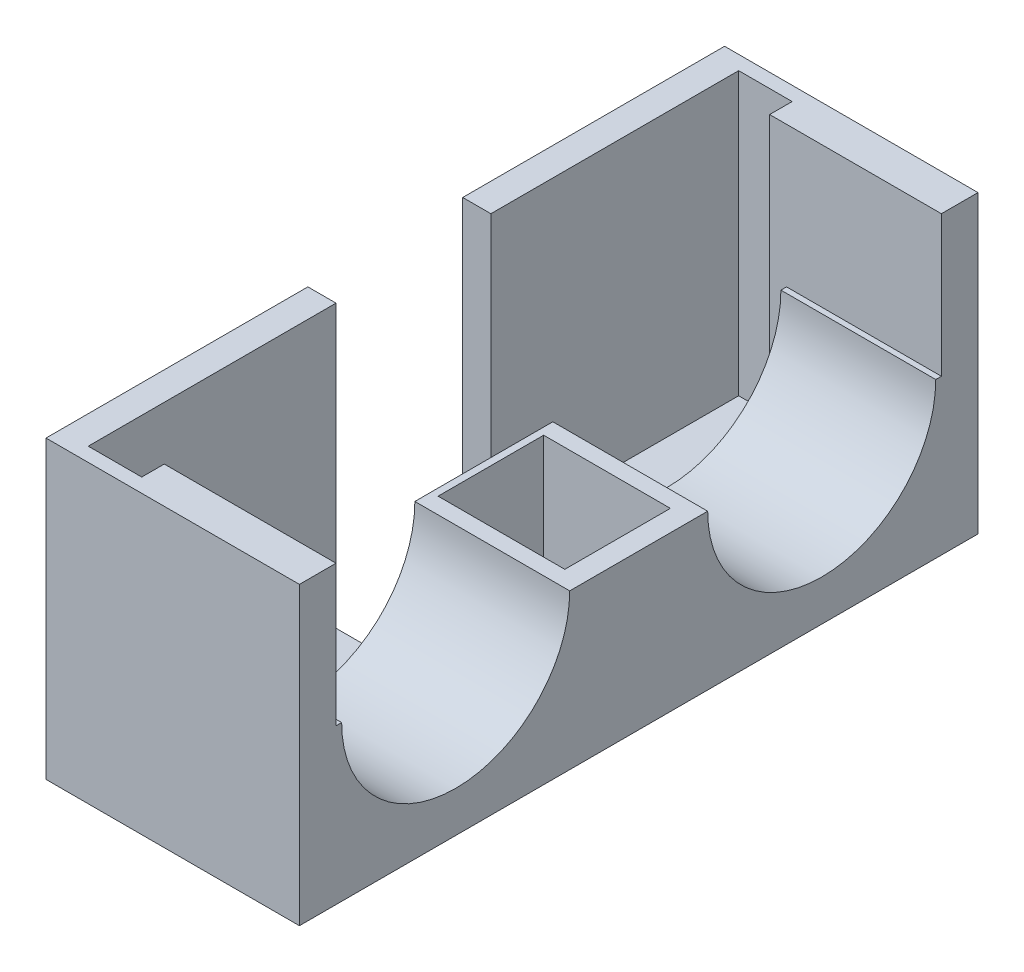
ISO-10303-21;
HEADER;
FILE_DESCRIPTION(('STEP AP214'),'2;1');
FILE_NAME('part.step','',(''),(''),'','','');
FILE_SCHEMA(('AUTOMOTIVE_DESIGN { 1 0 10303 214 1 1 1 1 }'));
ENDSEC;
DATA;
#1=APPLICATION_CONTEXT('core data for automotive mechanical design processes');
#2=APPLICATION_PROTOCOL_DEFINITION('international standard','automotive_design',2000,#1);
#3=PRODUCT_CONTEXT('',#1,'mechanical');
#4=PRODUCT('Part','Part','',(#3));
#5=PRODUCT_RELATED_PRODUCT_CATEGORY('part','',(#4));
#6=PRODUCT_DEFINITION_FORMATION('','',#4);
#7=PRODUCT_DEFINITION_CONTEXT('part definition',#1,'design');
#8=PRODUCT_DEFINITION('design','',#6,#7);
#9=PRODUCT_DEFINITION_SHAPE('','',#8);
#10=(LENGTH_UNIT() NAMED_UNIT(*) SI_UNIT(.MILLI.,.METRE.));
#11=(NAMED_UNIT(*) PLANE_ANGLE_UNIT() SI_UNIT($,.RADIAN.));
#12=(NAMED_UNIT(*) SI_UNIT($,.STERADIAN.) SOLID_ANGLE_UNIT());
#13=UNCERTAINTY_MEASURE_WITH_UNIT(LENGTH_MEASURE(1.E-05),#10,'distance_accuracy_value','');
#14=(GEOMETRIC_REPRESENTATION_CONTEXT(3) GLOBAL_UNCERTAINTY_ASSIGNED_CONTEXT((#13)) GLOBAL_UNIT_ASSIGNED_CONTEXT((#10,
#11,#12)) REPRESENTATION_CONTEXT('',''));
#15=CARTESIAN_POINT('',(0.,0.,0.));
#16=DIRECTION('',(0.,0.,1.));
#17=DIRECTION('',(1.,0.,0.));
#18=AXIS2_PLACEMENT_3D('',#15,#16,#17);
#19=CARTESIAN_POINT('',(0.,21.,0.));
#20=DIRECTION('',(0.,1.,0.));
#21=DIRECTION('',(0.,0.,1.));
#22=AXIS2_PLACEMENT_3D('',#19,#20,#21);
#23=PLANE('',#22);
#24=DIRECTION('',(1.,0.,0.));
#25=VECTOR('',#24,1.);
#26=CARTESIAN_POINT('',(-16.5,21.,5.5));
#27=LINE('',#26,#25);
#28=CARTESIAN_POINT('',(-16.5,21.,5.5));
#29=VERTEX_POINT('',#28);
#30=CARTESIAN_POINT('',(-14.5,21.,5.5));
#31=VERTEX_POINT('',#30);
#32=EDGE_CURVE('E509',#29,#31,#27,.T.);
#33=ORIENTED_EDGE('',*,*,#32,.F.);
#34=DIRECTION('',(0.,0.,-1.));
#35=VECTOR('',#34,1.);
#36=CARTESIAN_POINT('',(-16.5,21.,-24.1));
#37=LINE('',#36,#35);
#38=CARTESIAN_POINT('',(-16.5,21.,24.1));
#39=VERTEX_POINT('',#38);
#40=EDGE_CURVE('E365',#39,#29,#37,.T.);
#41=ORIENTED_EDGE('',*,*,#40,.F.);
#42=DIRECTION('',(1.,0.,0.));
#43=VECTOR('',#42,1.);
#44=CARTESIAN_POINT('',(1.5,21.,24.1));
#45=LINE('',#44,#43);
#46=CARTESIAN_POINT('',(1.5,21.,24.1));
#47=VERTEX_POINT('',#46);
#48=EDGE_CURVE('E443',#39,#47,#45,.T.);
#49=ORIENTED_EDGE('',*,*,#48,.T.);
#50=DIRECTION('',(0.,0.,-1.));
#51=VECTOR('',#50,1.);
#52=CARTESIAN_POINT('',(1.5,21.,21.5));
#53=LINE('',#52,#51);
#54=CARTESIAN_POINT('',(1.5,21.,21.5));
#55=VERTEX_POINT('',#54);
#56=EDGE_CURVE('E237',#47,#55,#53,.T.);
#57=ORIENTED_EDGE('',*,*,#56,.T.);
#58=DIRECTION('',(-1.,0.,0.));
#59=VECTOR('',#58,1.);
#60=CARTESIAN_POINT('',(1.5,21.,21.5));
#61=LINE('',#60,#59);
#62=CARTESIAN_POINT('',(-10.7,21.,21.5));
#63=VERTEX_POINT('',#62);
#64=EDGE_CURVE('E433',#55,#63,#61,.T.);
#65=ORIENTED_EDGE('',*,*,#64,.T.);
#66=DIRECTION('',(0.,0.,1.));
#67=VECTOR('',#66,1.);
#68=CARTESIAN_POINT('',(-10.7,21.,21.5));
#69=LINE('',#68,#67);
#70=CARTESIAN_POINT('',(-10.7,21.,23.1));
#71=VERTEX_POINT('',#70);
#72=EDGE_CURVE('E436',#63,#71,#69,.T.);
#73=ORIENTED_EDGE('',*,*,#72,.T.);
#74=DIRECTION('',(-1.,0.,0.));
#75=VECTOR('',#74,1.);
#76=CARTESIAN_POINT('',(-10.7,21.,23.1));
#77=LINE('',#76,#75);
#78=CARTESIAN_POINT('',(-14.5,21.,23.1));
#79=VERTEX_POINT('',#78);
#80=EDGE_CURVE('E440',#71,#79,#77,.T.);
#81=ORIENTED_EDGE('',*,*,#80,.T.);
#82=DIRECTION('',(0.,0.,-1.));
#83=VECTOR('',#82,1.);
#84=CARTESIAN_POINT('',(-14.5,21.,-24.1));
#85=LINE('',#84,#83);
#86=EDGE_CURVE('E379',#79,#31,#85,.T.);
#87=ORIENTED_EDGE('',*,*,#86,.T.);
#88=EDGE_LOOP('',(#33,#41,#49,#57,#65,#73,#81,#87));
#89=FACE_BOUND('',#88,.T.);
#90=ADVANCED_FACE('F43',(#89),#23,.T.);
#91=CARTESIAN_POINT('',(-14.5,0.,0.));
#92=DIRECTION('',(-1.,0.,0.));
#93=DIRECTION('',(0.,0.,1.));
#94=AXIS2_PLACEMENT_3D('',#91,#92,#93);
#95=PLANE('',#94);
#96=DIRECTION('',(0.,0.,-1.));
#97=VECTOR('',#96,1.);
#98=CARTESIAN_POINT('',(-14.5,1.,-23.1));
#99=LINE('',#98,#97);
#100=CARTESIAN_POINT('',(-14.5,1.,23.1));
#101=VERTEX_POINT('',#100);
#102=CARTESIAN_POINT('',(-14.5,1.,5.5));
#103=VERTEX_POINT('',#102);
#104=EDGE_CURVE('E389',#101,#103,#99,.T.);
#105=ORIENTED_EDGE('',*,*,#104,.T.);
#106=DIRECTION('',(0.,1.,0.));
#107=VECTOR('',#106,1.);
#108=CARTESIAN_POINT('',(-14.5,0.,5.5));
#109=LINE('',#108,#107);
#110=EDGE_CURVE('E525',#103,#31,#109,.T.);
#111=ORIENTED_EDGE('',*,*,#110,.T.);
#112=ORIENTED_EDGE('',*,*,#86,.F.);
#113=DIRECTION('',(0.,-1.,0.));
#114=VECTOR('',#113,1.);
#115=CARTESIAN_POINT('',(-14.5,1.,23.1));
#116=LINE('',#115,#114);
#117=EDGE_CURVE('E373',#79,#101,#116,.T.);
#118=ORIENTED_EDGE('',*,*,#117,.T.);
#119=EDGE_LOOP('',(#105,#111,#112,#118));
#120=FACE_BOUND('',#119,.T.);
#121=ADVANCED_FACE('F485',(#120),#95,.F.);
#122=CARTESIAN_POINT('',(-16.5,0.,0.));
#123=DIRECTION('',(-1.,0.,0.));
#124=DIRECTION('',(0.,0.,1.));
#125=AXIS2_PLACEMENT_3D('',#122,#123,#124);
#126=PLANE('',#125);
#127=DIRECTION('',(0.,1.,0.));
#128=VECTOR('',#127,1.);
#129=CARTESIAN_POINT('',(-16.5,0.,5.5));
#130=LINE('',#129,#128);
#131=CARTESIAN_POINT('',(-16.5,0.,5.5));
#132=VERTEX_POINT('',#131);
#133=EDGE_CURVE('E537',#132,#29,#130,.T.);
#134=ORIENTED_EDGE('',*,*,#133,.F.);
#135=DIRECTION('',(0.,0.,1.));
#136=VECTOR('',#135,1.);
#137=CARTESIAN_POINT('',(-16.5,0.,-24.1));
#138=LINE('',#137,#136);
#139=CARTESIAN_POINT('',(-16.5,0.,24.1));
#140=VERTEX_POINT('',#139);
#141=EDGE_CURVE('E530',#132,#140,#138,.T.);
#142=ORIENTED_EDGE('',*,*,#141,.T.);
#143=DIRECTION('',(0.,1.,0.));
#144=VECTOR('',#143,1.);
#145=CARTESIAN_POINT('',(-16.5,21.,24.1));
#146=LINE('',#145,#144);
#147=EDGE_CURVE('E258',#140,#39,#146,.T.);
#148=ORIENTED_EDGE('',*,*,#147,.T.);
#149=ORIENTED_EDGE('',*,*,#40,.T.);
#150=EDGE_LOOP('',(#134,#142,#148,#149));
#151=FACE_BOUND('',#150,.T.);
#152=ADVANCED_FACE('F491',(#151),#126,.T.);
#153=CARTESIAN_POINT('',(0.,1.,0.));
#154=DIRECTION('',(0.,-1.,0.));
#155=DIRECTION('',(0.,0.,-1.));
#156=AXIS2_PLACEMENT_3D('',#153,#154,#155);
#157=PLANE('',#156);
#158=DIRECTION('',(0.,0.,1.));
#159=VECTOR('',#158,1.);
#160=CARTESIAN_POINT('',(-12.5,1.,0.));
#161=LINE('',#160,#159);
#162=CARTESIAN_POINT('',(-12.5,1.,-5.5));
#163=VERTEX_POINT('',#162);
#164=CARTESIAN_POINT('',(-12.5,1.,5.5));
#165=VERTEX_POINT('',#164);
#166=EDGE_CURVE('E516',#163,#165,#161,.T.);
#167=ORIENTED_EDGE('',*,*,#166,.T.);
#168=DIRECTION('',(-1.,0.,0.));
#169=VECTOR('',#168,1.);
#170=CARTESIAN_POINT('',(0.,1.,5.5));
#171=LINE('',#170,#169);
#172=EDGE_CURVE('E520',#165,#103,#171,.T.);
#173=ORIENTED_EDGE('',*,*,#172,.T.);
#174=ORIENTED_EDGE('',*,*,#104,.F.);
#175=DIRECTION('',(-1.,0.,0.));
#176=VECTOR('',#175,1.);
#177=CARTESIAN_POINT('',(-10.7,1.,23.1));
#178=LINE('',#177,#176);
#179=CARTESIAN_POINT('',(-10.7,1.,23.1));
#180=VERTEX_POINT('',#179);
#181=EDGE_CURVE('E437',#180,#101,#178,.T.);
#182=ORIENTED_EDGE('',*,*,#181,.F.);
#183=DIRECTION('',(0.,0.,1.));
#184=VECTOR('',#183,1.);
#185=CARTESIAN_POINT('',(-10.7,1.,21.5));
#186=LINE('',#185,#184);
#187=CARTESIAN_POINT('',(-10.7,1.,21.5));
#188=VERTEX_POINT('',#187);
#189=EDGE_CURVE('E354',#188,#180,#186,.T.);
#190=ORIENTED_EDGE('',*,*,#189,.F.);
#191=DIRECTION('',(-1.,0.,0.));
#192=VECTOR('',#191,1.);
#193=CARTESIAN_POINT('',(-9.5,1.,21.5));
#194=LINE('',#193,#192);
#195=CARTESIAN_POINT('',(-9.5,1.,21.5));
#196=VERTEX_POINT('',#195);
#197=EDGE_CURVE('E352',#196,#188,#194,.T.);
#198=ORIENTED_EDGE('',*,*,#197,.F.);
#199=DIRECTION('',(0.,0.,1.));
#200=VECTOR('',#199,1.);
#201=CARTESIAN_POINT('',(-9.5,1.,21.5));
#202=LINE('',#201,#200);
#203=CARTESIAN_POINT('',(-9.5,1.,-21.5));
#204=VERTEX_POINT('',#203);
#205=EDGE_CURVE('E322',#204,#196,#202,.T.);
#206=ORIENTED_EDGE('',*,*,#205,.F.);
#207=DIRECTION('',(-1.,0.,0.));
#208=VECTOR('',#207,1.);
#209=CARTESIAN_POINT('',(-9.5,1.,-21.5));
#210=LINE('',#209,#208);
#211=CARTESIAN_POINT('',(-10.7,1.,-21.5));
#212=VERTEX_POINT('',#211);
#213=EDGE_CURVE('E334',#204,#212,#210,.T.);
#214=ORIENTED_EDGE('',*,*,#213,.T.);
#215=DIRECTION('',(0.,0.,-1.));
#216=VECTOR('',#215,1.);
#217=CARTESIAN_POINT('',(-10.7,1.,-21.5));
#218=LINE('',#217,#216);
#219=CARTESIAN_POINT('',(-10.7,1.,-23.1));
#220=VERTEX_POINT('',#219);
#221=EDGE_CURVE('E419',#212,#220,#218,.T.);
#222=ORIENTED_EDGE('',*,*,#221,.T.);
#223=DIRECTION('',(-1.,0.,0.));
#224=VECTOR('',#223,1.);
#225=CARTESIAN_POINT('',(-10.7,1.,-23.1));
#226=LINE('',#225,#224);
#227=CARTESIAN_POINT('',(-14.5,1.,-23.1));
#228=VERTEX_POINT('',#227);
#229=EDGE_CURVE('E397',#220,#228,#226,.T.);
#230=ORIENTED_EDGE('',*,*,#229,.T.);
#231=CARTESIAN_POINT('',(-14.5,1.,-5.5));
#232=VERTEX_POINT('',#231);
#233=EDGE_CURVE('E388',#232,#228,#99,.T.);
#234=ORIENTED_EDGE('',*,*,#233,.F.);
#235=DIRECTION('',(1.,0.,0.));
#236=VECTOR('',#235,1.);
#237=CARTESIAN_POINT('',(0.,1.,-5.5));
#238=LINE('',#237,#236);
#239=EDGE_CURVE('E565',#232,#163,#238,.T.);
#240=ORIENTED_EDGE('',*,*,#239,.T.);
#241=EDGE_LOOP('',(#167,#173,#174,#182,#190,#198,#206,#214,#222,#230,#234,#240));
#242=FACE_BOUND('',#241,.T.);
#243=ADVANCED_FACE('F576',(#242),#157,.F.);
#244=CARTESIAN_POINT('',(0.,11.,0.));
#245=DIRECTION('',(0.,-1.,0.));
#246=DIRECTION('',(0.,0.,-1.));
#247=AXIS2_PLACEMENT_3D('',#244,#245,#246);
#248=PLANE('',#247);
#249=DIRECTION('',(-1.,0.,0.));
#250=VECTOR('',#249,1.);
#251=CARTESIAN_POINT('',(-9.00000000000001,11.,-3.75));
#252=LINE('',#251,#250);
#253=CARTESIAN_POINT('',(0.,11.,-3.75));
#254=VERTEX_POINT('',#253);
#255=CARTESIAN_POINT('',(-9.00000000000001,11.,-3.75));
#256=VERTEX_POINT('',#255);
#257=EDGE_CURVE('E600',#254,#256,#252,.T.);
#258=ORIENTED_EDGE('',*,*,#257,.F.);
#259=DIRECTION('',(0.,0.,-1.));
#260=VECTOR('',#259,1.);
#261=CARTESIAN_POINT('',(0.,11.,3.75));
#262=LINE('',#261,#260);
#263=CARTESIAN_POINT('',(0.,11.,3.75));
#264=VERTEX_POINT('',#263);
#265=EDGE_CURVE('E59',#264,#254,#262,.T.);
#266=ORIENTED_EDGE('',*,*,#265,.F.);
#267=DIRECTION('',(1.,0.,0.));
#268=VECTOR('',#267,1.);
#269=CARTESIAN_POINT('',(-9.00000000000001,11.,3.75));
#270=LINE('',#269,#268);
#271=CARTESIAN_POINT('',(-9.00000000000001,11.,3.75));
#272=VERTEX_POINT('',#271);
#273=EDGE_CURVE('E591',#272,#264,#270,.T.);
#274=ORIENTED_EDGE('',*,*,#273,.F.);
#275=DIRECTION('',(0.,0.,1.));
#276=VECTOR('',#275,1.);
#277=CARTESIAN_POINT('',(-9.00000000000001,11.,3.75));
#278=LINE('',#277,#276);
#279=EDGE_CURVE('E596',#256,#272,#278,.T.);
#280=ORIENTED_EDGE('',*,*,#279,.F.);
#281=EDGE_LOOP('',(#258,#266,#274,#280));
#282=FACE_BOUND('',#281,.T.);
#283=DIRECTION('',(0.,0.,1.));
#284=VECTOR('',#283,1.);
#285=CARTESIAN_POINT('',(-9.5,11.,21.5));
#286=LINE('',#285,#284);
#287=CARTESIAN_POINT('',(-9.5,11.,-4.9));
#288=VERTEX_POINT('',#287);
#289=CARTESIAN_POINT('',(-9.5,11.,4.9));
#290=VERTEX_POINT('',#289);
#291=EDGE_CURVE('E300',#288,#290,#286,.T.);
#292=ORIENTED_EDGE('',*,*,#291,.T.);
#293=DIRECTION('',(1.,0.,0.));
#294=VECTOR('',#293,1.);
#295=CARTESIAN_POINT('',(-9.5,11.,4.9));
#296=LINE('',#295,#294);
#297=CARTESIAN_POINT('',(1.5,11.,4.9));
#298=VERTEX_POINT('',#297);
#299=EDGE_CURVE('E11',#290,#298,#296,.T.);
#300=ORIENTED_EDGE('',*,*,#299,.T.);
#301=DIRECTION('',(0.,0.,-1.));
#302=VECTOR('',#301,1.);
#303=CARTESIAN_POINT('',(1.5,11.,21.5));
#304=LINE('',#303,#302);
#305=CARTESIAN_POINT('',(1.5,11.,-4.9));
#306=VERTEX_POINT('',#305);
#307=EDGE_CURVE('E340',#298,#306,#304,.T.);
#308=ORIENTED_EDGE('',*,*,#307,.T.);
#309=DIRECTION('',(1.,0.,0.));
#310=VECTOR('',#309,1.);
#311=CARTESIAN_POINT('',(-9.5,11.,-4.9));
#312=LINE('',#311,#310);
#313=EDGE_CURVE('E260',#306,#288,#312,.F.);
#314=ORIENTED_EDGE('',*,*,#313,.T.);
#315=EDGE_LOOP('',(#292,#300,#308,#314));
#316=FACE_BOUND('',#315,.T.);
#317=ADVANCED_FACE('F472',(#282,#316),#248,.F.);
#318=CARTESIAN_POINT('',(-9.5,11.,-21.5));
#319=VERTEX_POINT('',#318);
#320=CARTESIAN_POINT('',(-9.5,11.,-21.1));
#321=VERTEX_POINT('',#320);
#322=EDGE_CURVE('E303',#319,#321,#286,.T.);
#323=ORIENTED_EDGE('',*,*,#322,.T.);
#324=DIRECTION('',(1.,0.,0.));
#325=VECTOR('',#324,1.);
#326=CARTESIAN_POINT('',(-9.5,11.,-21.1));
#327=LINE('',#326,#325);
#328=CARTESIAN_POINT('',(1.5,11.,-21.1));
#329=VERTEX_POINT('',#328);
#330=EDGE_CURVE('E266',#321,#329,#327,.T.);
#331=ORIENTED_EDGE('',*,*,#330,.T.);
#332=CARTESIAN_POINT('',(1.5,11.,-21.5));
#333=VERTEX_POINT('',#332);
#334=EDGE_CURVE('E324',#329,#333,#304,.T.);
#335=ORIENTED_EDGE('',*,*,#334,.T.);
#336=DIRECTION('',(-1.,0.,0.));
#337=VECTOR('',#336,1.);
#338=CARTESIAN_POINT('',(-9.5,11.,-21.5));
#339=LINE('',#338,#337);
#340=EDGE_CURVE('E301',#333,#319,#339,.T.);
#341=ORIENTED_EDGE('',*,*,#340,.T.);
#342=EDGE_LOOP('',(#323,#331,#335,#341));
#343=FACE_BOUND('',#342,.T.);
#344=ADVANCED_FACE('F336',(#343),#248,.F.);
#345=CARTESIAN_POINT('',(-12.5,1.,-24.1));
#346=DIRECTION('',(0.,0.,1.));
#347=DIRECTION('',(1.,0.,0.));
#348=AXIS2_PLACEMENT_3D('',#345,#346,#347);
#349=PLANE('',#348);
#350=DIRECTION('',(0.,-1.,0.));
#351=VECTOR('',#350,1.);
#352=CARTESIAN_POINT('',(1.5,21.,-24.1));
#353=LINE('',#352,#351);
#354=CARTESIAN_POINT('',(1.5,21.,-24.1));
#355=VERTEX_POINT('',#354);
#356=CARTESIAN_POINT('',(1.5,0.,-24.1));
#357=VERTEX_POINT('',#356);
#358=EDGE_CURVE('E428',#355,#357,#353,.T.);
#359=ORIENTED_EDGE('',*,*,#358,.T.);
#360=DIRECTION('',(-1.,0.,0.));
#361=VECTOR('',#360,1.);
#362=CARTESIAN_POINT('',(-12.5,0.,-24.1));
#363=LINE('',#362,#361);
#364=CARTESIAN_POINT('',(-16.5,0.,-24.1));
#365=VERTEX_POINT('',#364);
#366=EDGE_CURVE('E252',#357,#365,#363,.T.);
#367=ORIENTED_EDGE('',*,*,#366,.T.);
#368=DIRECTION('',(0.,-1.,0.));
#369=VECTOR('',#368,1.);
#370=CARTESIAN_POINT('',(-16.5,21.,-24.1));
#371=LINE('',#370,#369);
#372=CARTESIAN_POINT('',(-16.5,21.,-24.1));
#373=VERTEX_POINT('',#372);
#374=EDGE_CURVE('E383',#373,#365,#371,.T.);
#375=ORIENTED_EDGE('',*,*,#374,.F.);
#376=DIRECTION('',(1.,0.,0.));
#377=VECTOR('',#376,1.);
#378=CARTESIAN_POINT('',(1.5,21.,-24.1));
#379=LINE('',#378,#377);
#380=EDGE_CURVE('E404',#373,#355,#379,.T.);
#381=ORIENTED_EDGE('',*,*,#380,.T.);
#382=EDGE_LOOP('',(#359,#367,#375,#381));
#383=FACE_BOUND('',#382,.T.);
#384=ADVANCED_FACE('F45',(#383),#349,.F.);
#385=CARTESIAN_POINT('',(-12.5,1.,24.1));
#386=DIRECTION('',(0.,0.,-1.));
#387=DIRECTION('',(-1.,0.,0.));
#388=AXIS2_PLACEMENT_3D('',#385,#386,#387);
#389=PLANE('',#388);
#390=DIRECTION('',(1.,0.,0.));
#391=VECTOR('',#390,1.);
#392=CARTESIAN_POINT('',(-12.5,0.,24.1));
#393=LINE('',#392,#391);
#394=CARTESIAN_POINT('',(1.5,0.,24.1));
#395=VERTEX_POINT('',#394);
#396=EDGE_CURVE('E249',#140,#395,#393,.T.);
#397=ORIENTED_EDGE('',*,*,#396,.T.);
#398=DIRECTION('',(0.,-1.,0.));
#399=VECTOR('',#398,1.);
#400=CARTESIAN_POINT('',(1.5,21.,24.1));
#401=LINE('',#400,#399);
#402=EDGE_CURVE('E230',#47,#395,#401,.T.);
#403=ORIENTED_EDGE('',*,*,#402,.F.);
#404=ORIENTED_EDGE('',*,*,#48,.F.);
#405=ORIENTED_EDGE('',*,*,#147,.F.);
#406=EDGE_LOOP('',(#397,#403,#404,#405));
#407=FACE_BOUND('',#406,.T.);
#408=ADVANCED_FACE('F256',(#407),#389,.F.);
#409=CARTESIAN_POINT('',(0.,0.,0.));
#410=DIRECTION('',(0.,-1.,0.));
#411=DIRECTION('',(0.,0.,-1.));
#412=AXIS2_PLACEMENT_3D('',#409,#410,#411);
#413=PLANE('',#412);
#414=DIRECTION('',(0.,0.,1.));
#415=VECTOR('',#414,1.);
#416=CARTESIAN_POINT('',(1.5,0.,-24.1));
#417=LINE('',#416,#415);
#418=EDGE_CURVE('E234',#357,#395,#417,.T.);
#419=ORIENTED_EDGE('',*,*,#418,.T.);
#420=ORIENTED_EDGE('',*,*,#396,.F.);
#421=ORIENTED_EDGE('',*,*,#141,.F.);
#422=DIRECTION('',(1.,0.,0.));
#423=VECTOR('',#422,1.);
#424=CARTESIAN_POINT('',(-16.5,0.,5.5));
#425=LINE('',#424,#423);
#426=CARTESIAN_POINT('',(-12.5,0.,5.5));
#427=VERTEX_POINT('',#426);
#428=EDGE_CURVE('E540',#132,#427,#425,.T.);
#429=ORIENTED_EDGE('',*,*,#428,.T.);
#430=DIRECTION('',(0.,0.,-1.));
#431=VECTOR('',#430,1.);
#432=CARTESIAN_POINT('',(-12.5,0.,5.5));
#433=LINE('',#432,#431);
#434=CARTESIAN_POINT('',(-12.5,0.,-5.5));
#435=VERTEX_POINT('',#434);
#436=EDGE_CURVE('E543',#427,#435,#433,.T.);
#437=ORIENTED_EDGE('',*,*,#436,.T.);
#438=DIRECTION('',(-1.,0.,0.));
#439=VECTOR('',#438,1.);
#440=CARTESIAN_POINT('',(-16.5,0.,-5.5));
#441=LINE('',#440,#439);
#442=CARTESIAN_POINT('',(-16.5,0.,-5.5));
#443=VERTEX_POINT('',#442);
#444=EDGE_CURVE('E547',#435,#443,#441,.T.);
#445=ORIENTED_EDGE('',*,*,#444,.T.);
#446=EDGE_CURVE('E375',#365,#443,#138,.T.);
#447=ORIENTED_EDGE('',*,*,#446,.F.);
#448=ORIENTED_EDGE('',*,*,#366,.F.);
#449=EDGE_LOOP('',(#419,#420,#421,#429,#437,#445,#447,#448));
#450=FACE_BOUND('',#449,.T.);
#451=CARTESIAN_POINT('',(-3.75,0.,2.5));
#452=DIRECTION('',(0.,1.,0.));
#453=DIRECTION('',(0.,0.,1.));
#454=AXIS2_PLACEMENT_3D('',#451,#452,#453);
#455=CIRCLE('',#454,0.5);
#456=CARTESIAN_POINT('',(-3.75,0.,3.));
#457=VERTEX_POINT('',#456);
#458=EDGE_CURVE('E254',#457,#457,#455,.T.);
#459=ORIENTED_EDGE('',*,*,#458,.T.);
#460=EDGE_LOOP('',(#459));
#461=FACE_BOUND('',#460,.T.);
#462=CARTESIAN_POINT('',(-3.75,0.,-2.5));
#463=DIRECTION('',(0.,1.,0.));
#464=DIRECTION('',(0.,0.,1.));
#465=AXIS2_PLACEMENT_3D('',#462,#463,#464);
#466=CIRCLE('',#465,0.5);
#467=CARTESIAN_POINT('',(-3.75,0.,-2.));
#468=VERTEX_POINT('',#467);
#469=EDGE_CURVE('E633',#468,#468,#466,.T.);
#470=ORIENTED_EDGE('',*,*,#469,.T.);
#471=EDGE_LOOP('',(#470));
#472=FACE_BOUND('',#471,.T.);
#473=CARTESIAN_POINT('',(-4.5,0.,0.));
#474=DIRECTION('',(0.,1.,0.));
#475=DIRECTION('',(0.,0.,1.));
#476=AXIS2_PLACEMENT_3D('',#473,#474,#475);
#477=CIRCLE('',#476,0.75);
#478=CARTESIAN_POINT('',(-4.5,0.,0.75));
#479=VERTEX_POINT('',#478);
#480=EDGE_CURVE('E605',#479,#479,#477,.T.);
#481=ORIENTED_EDGE('',*,*,#480,.T.);
#482=EDGE_LOOP('',(#481));
#483=FACE_BOUND('',#482,.T.);
#484=ADVANCED_FACE('F246',(#450,#461,#472,#483),#413,.T.);
#485=CARTESIAN_POINT('',(1.5,11.,21.5));
#486=DIRECTION('',(-1.,0.,0.));
#487=DIRECTION('',(0.,0.,1.));
#488=AXIS2_PLACEMENT_3D('',#485,#486,#487);
#489=PLANE('',#488);
#490=ORIENTED_EDGE('',*,*,#307,.F.);
#491=CARTESIAN_POINT('',(1.5,11.,13.));
#492=DIRECTION('',(1.,0.,0.));
#493=DIRECTION('',(0.,0.,-1.));
#494=AXIS2_PLACEMENT_3D('',#491,#492,#493);
#495=CIRCLE('',#494,8.1);
#496=CARTESIAN_POINT('',(1.5,11.,21.1));
#497=VERTEX_POINT('',#496);
#498=EDGE_CURVE('E463',#497,#298,#495,.T.);
#499=ORIENTED_EDGE('',*,*,#498,.F.);
#500=CARTESIAN_POINT('',(1.5,11.,21.5));
#501=VERTEX_POINT('',#500);
#502=EDGE_CURVE('E288',#501,#497,#304,.T.);
#503=ORIENTED_EDGE('',*,*,#502,.F.);
#504=DIRECTION('',(0.,-1.,0.));
#505=VECTOR('',#504,1.);
#506=CARTESIAN_POINT('',(1.5,21.,21.5));
#507=LINE('',#506,#505);
#508=EDGE_CURVE('E242',#55,#501,#507,.T.);
#509=ORIENTED_EDGE('',*,*,#508,.F.);
#510=ORIENTED_EDGE('',*,*,#56,.F.);
#511=ORIENTED_EDGE('',*,*,#402,.T.);
#512=ORIENTED_EDGE('',*,*,#418,.F.);
#513=ORIENTED_EDGE('',*,*,#358,.F.);
#514=DIRECTION('',(0.,0.,1.));
#515=VECTOR('',#514,1.);
#516=CARTESIAN_POINT('',(1.5,21.,-21.5));
#517=LINE('',#516,#515);
#518=CARTESIAN_POINT('',(1.5,21.,-21.5));
#519=VERTEX_POINT('',#518);
#520=EDGE_CURVE('E401',#355,#519,#517,.T.);
#521=ORIENTED_EDGE('',*,*,#520,.T.);
#522=DIRECTION('',(0.,-1.,0.));
#523=VECTOR('',#522,1.);
#524=CARTESIAN_POINT('',(1.5,21.,-21.5));
#525=LINE('',#524,#523);
#526=EDGE_CURVE('E355',#519,#333,#525,.T.);
#527=ORIENTED_EDGE('',*,*,#526,.T.);
#528=ORIENTED_EDGE('',*,*,#334,.F.);
#529=CARTESIAN_POINT('',(1.5,11.,-13.));
#530=DIRECTION('',(1.,0.,0.));
#531=DIRECTION('',(0.,0.,-1.));
#532=AXIS2_PLACEMENT_3D('',#529,#530,#531);
#533=CIRCLE('',#532,8.1);
#534=EDGE_CURVE('E465',#306,#329,#533,.T.);
#535=ORIENTED_EDGE('',*,*,#534,.F.);
#536=EDGE_LOOP('',(#490,#499,#503,#509,#510,#511,#512,#513,#521,#527,#528,#535));
#537=FACE_BOUND('',#536,.T.);
#538=ADVANCED_FACE('F233',(#537),#489,.F.);
#539=CARTESIAN_POINT('',(-9.5,11.,21.5));
#540=DIRECTION('',(1.,0.,0.));
#541=DIRECTION('',(0.,0.,-1.));
#542=AXIS2_PLACEMENT_3D('',#539,#540,#541);
#543=PLANE('',#542);
#544=CARTESIAN_POINT('',(-9.5,11.,21.1));
#545=VERTEX_POINT('',#544);
#546=CARTESIAN_POINT('',(-9.5,11.,21.5));
#547=VERTEX_POINT('',#546);
#548=EDGE_CURVE('E285',#545,#547,#286,.T.);
#549=ORIENTED_EDGE('',*,*,#548,.F.);
#550=CARTESIAN_POINT('',(-9.5,11.,13.));
#551=DIRECTION('',(1.,0.,0.));
#552=DIRECTION('',(0.,0.,-1.));
#553=AXIS2_PLACEMENT_3D('',#550,#551,#552);
#554=CIRCLE('',#553,8.1);
#555=EDGE_CURVE('E295',#545,#290,#554,.T.);
#556=ORIENTED_EDGE('',*,*,#555,.T.);
#557=ORIENTED_EDGE('',*,*,#291,.F.);
#558=CARTESIAN_POINT('',(-9.5,11.,-13.));
#559=DIRECTION('',(1.,0.,0.));
#560=DIRECTION('',(0.,0.,-1.));
#561=AXIS2_PLACEMENT_3D('',#558,#559,#560);
#562=CIRCLE('',#561,8.1);
#563=EDGE_CURVE('E460',#288,#321,#562,.T.);
#564=ORIENTED_EDGE('',*,*,#563,.T.);
#565=ORIENTED_EDGE('',*,*,#322,.F.);
#566=DIRECTION('',(0.,-1.,0.));
#567=VECTOR('',#566,1.);
#568=CARTESIAN_POINT('',(-9.5,11.,-21.5));
#569=LINE('',#568,#567);
#570=EDGE_CURVE('E269',#319,#204,#569,.T.);
#571=ORIENTED_EDGE('',*,*,#570,.T.);
#572=ORIENTED_EDGE('',*,*,#205,.T.);
#573=DIRECTION('',(0.,-1.,0.));
#574=VECTOR('',#573,1.);
#575=CARTESIAN_POINT('',(-9.5,11.,21.5));
#576=LINE('',#575,#574);
#577=EDGE_CURVE('E298',#547,#196,#576,.T.);
#578=ORIENTED_EDGE('',*,*,#577,.F.);
#579=EDGE_LOOP('',(#549,#556,#557,#564,#565,#571,#572,#578));
#580=FACE_BOUND('',#579,.T.);
#581=ADVANCED_FACE('F293',(#580),#543,.F.);
#582=ORIENTED_EDGE('',*,*,#502,.T.);
#583=DIRECTION('',(1.,0.,0.));
#584=VECTOR('',#583,1.);
#585=CARTESIAN_POINT('',(-9.5,11.,21.1));
#586=LINE('',#585,#584);
#587=EDGE_CURVE('E52',#497,#545,#586,.F.);
#588=ORIENTED_EDGE('',*,*,#587,.T.);
#589=ORIENTED_EDGE('',*,*,#548,.T.);
#590=DIRECTION('',(1.,0.,0.));
#591=VECTOR('',#590,1.);
#592=CARTESIAN_POINT('',(-9.5,11.,21.5));
#593=LINE('',#592,#591);
#594=EDGE_CURVE('E313',#547,#501,#593,.T.);
#595=ORIENTED_EDGE('',*,*,#594,.T.);
#596=EDGE_LOOP('',(#582,#588,#589,#595));
#597=FACE_BOUND('',#596,.T.);
#598=ADVANCED_FACE('F283',(#597),#248,.F.);
#599=CARTESIAN_POINT('',(-9.5,11.,-13.));
#600=DIRECTION('',(1.,0.,0.));
#601=DIRECTION('',(0.,0.,-1.));
#602=AXIS2_PLACEMENT_3D('',#599,#600,#601);
#603=CYLINDRICAL_SURFACE('',#602,8.1);
#604=ORIENTED_EDGE('',*,*,#563,.F.);
#605=ORIENTED_EDGE('',*,*,#313,.F.);
#606=ORIENTED_EDGE('',*,*,#534,.T.);
#607=ORIENTED_EDGE('',*,*,#330,.F.);
#608=EDGE_LOOP('',(#604,#605,#606,#607));
#609=FACE_BOUND('',#608,.T.);
#610=ADVANCED_FACE('F470',(#609),#603,.F.);
#611=CARTESIAN_POINT('',(-9.5,11.,13.));
#612=DIRECTION('',(1.,0.,0.));
#613=DIRECTION('',(0.,0.,-1.));
#614=AXIS2_PLACEMENT_3D('',#611,#612,#613);
#615=CYLINDRICAL_SURFACE('',#614,8.1);
#616=ORIENTED_EDGE('',*,*,#555,.F.);
#617=ORIENTED_EDGE('',*,*,#587,.F.);
#618=ORIENTED_EDGE('',*,*,#498,.T.);
#619=ORIENTED_EDGE('',*,*,#299,.F.);
#620=EDGE_LOOP('',(#616,#617,#618,#619));
#621=FACE_BOUND('',#620,.T.);
#622=ADVANCED_FACE('F473',(#621),#615,.F.);
#623=CARTESIAN_POINT('',(-9.5,21.,21.5));
#624=DIRECTION('',(0.,0.,1.));
#625=DIRECTION('',(1.,0.,0.));
#626=AXIS2_PLACEMENT_3D('',#623,#624,#625);
#627=PLANE('',#626);
#628=ORIENTED_EDGE('',*,*,#594,.F.);
#629=ORIENTED_EDGE('',*,*,#577,.T.);
#630=ORIENTED_EDGE('',*,*,#197,.T.);
#631=DIRECTION('',(0.,-1.,0.));
#632=VECTOR('',#631,1.);
#633=CARTESIAN_POINT('',(-10.7,21.,21.5));
#634=LINE('',#633,#632);
#635=EDGE_CURVE('E456',#63,#188,#634,.T.);
#636=ORIENTED_EDGE('',*,*,#635,.F.);
#637=ORIENTED_EDGE('',*,*,#64,.F.);
#638=ORIENTED_EDGE('',*,*,#508,.T.);
#639=EDGE_LOOP('',(#628,#629,#630,#636,#637,#638));
#640=FACE_BOUND('',#639,.T.);
#641=ADVANCED_FACE('F475',(#640),#627,.F.);
#642=CARTESIAN_POINT('',(-10.7,21.,21.5));
#643=DIRECTION('',(1.,0.,0.));
#644=DIRECTION('',(0.,0.,-1.));
#645=AXIS2_PLACEMENT_3D('',#642,#643,#644);
#646=PLANE('',#645);
#647=ORIENTED_EDGE('',*,*,#189,.T.);
#648=DIRECTION('',(0.,-1.,0.));
#649=VECTOR('',#648,1.);
#650=CARTESIAN_POINT('',(-10.7,21.,23.1));
#651=LINE('',#650,#649);
#652=EDGE_CURVE('E241',#71,#180,#651,.T.);
#653=ORIENTED_EDGE('',*,*,#652,.F.);
#654=ORIENTED_EDGE('',*,*,#72,.F.);
#655=ORIENTED_EDGE('',*,*,#635,.T.);
#656=EDGE_LOOP('',(#647,#653,#654,#655));
#657=FACE_BOUND('',#656,.T.);
#658=ADVANCED_FACE('F480',(#657),#646,.F.);
#659=CARTESIAN_POINT('',(-10.7,21.,23.1));
#660=DIRECTION('',(0.,0.,1.));
#661=DIRECTION('',(1.,0.,0.));
#662=AXIS2_PLACEMENT_3D('',#659,#660,#661);
#663=PLANE('',#662);
#664=ORIENTED_EDGE('',*,*,#181,.T.);
#665=ORIENTED_EDGE('',*,*,#117,.F.);
#666=ORIENTED_EDGE('',*,*,#80,.F.);
#667=ORIENTED_EDGE('',*,*,#652,.T.);
#668=EDGE_LOOP('',(#664,#665,#666,#667));
#669=FACE_BOUND('',#668,.T.);
#670=ADVANCED_FACE('F499',(#669),#663,.F.);
#671=DIRECTION('',(-1.,0.,0.));
#672=VECTOR('',#671,1.);
#673=CARTESIAN_POINT('',(-16.5,21.,-5.5));
#674=LINE('',#673,#672);
#675=CARTESIAN_POINT('',(-14.5,21.,-5.5));
#676=VERTEX_POINT('',#675);
#677=CARTESIAN_POINT('',(-16.5,21.,-5.5));
#678=VERTEX_POINT('',#677);
#679=EDGE_CURVE('E67',#676,#678,#674,.T.);
#680=ORIENTED_EDGE('',*,*,#679,.F.);
#681=CARTESIAN_POINT('',(-14.5,21.,-23.1));
#682=VERTEX_POINT('',#681);
#683=EDGE_CURVE('E384',#676,#682,#85,.T.);
#684=ORIENTED_EDGE('',*,*,#683,.T.);
#685=DIRECTION('',(-1.,0.,0.));
#686=VECTOR('',#685,1.);
#687=CARTESIAN_POINT('',(-10.7,21.,-23.1));
#688=LINE('',#687,#686);
#689=CARTESIAN_POINT('',(-10.7,21.,-23.1));
#690=VERTEX_POINT('',#689);
#691=EDGE_CURVE('E408',#690,#682,#688,.T.);
#692=ORIENTED_EDGE('',*,*,#691,.F.);
#693=DIRECTION('',(0.,0.,-1.));
#694=VECTOR('',#693,1.);
#695=CARTESIAN_POINT('',(-10.7,21.,-21.5));
#696=LINE('',#695,#694);
#697=CARTESIAN_POINT('',(-10.7,21.,-21.5));
#698=VERTEX_POINT('',#697);
#699=EDGE_CURVE('E412',#698,#690,#696,.T.);
#700=ORIENTED_EDGE('',*,*,#699,.F.);
#701=DIRECTION('',(-1.,0.,0.));
#702=VECTOR('',#701,1.);
#703=CARTESIAN_POINT('',(1.5,21.,-21.5));
#704=LINE('',#703,#702);
#705=EDGE_CURVE('E398',#519,#698,#704,.T.);
#706=ORIENTED_EDGE('',*,*,#705,.F.);
#707=ORIENTED_EDGE('',*,*,#520,.F.);
#708=ORIENTED_EDGE('',*,*,#380,.F.);
#709=EDGE_CURVE('E364',#678,#373,#37,.T.);
#710=ORIENTED_EDGE('',*,*,#709,.F.);
#711=EDGE_LOOP('',(#680,#684,#692,#700,#706,#707,#708,#710));
#712=FACE_BOUND('',#711,.T.);
#713=ADVANCED_FACE('F488',(#712),#23,.T.);
#714=CARTESIAN_POINT('',(-9.5,21.,-21.5));
#715=DIRECTION('',(0.,0.,1.));
#716=DIRECTION('',(1.,0.,0.));
#717=AXIS2_PLACEMENT_3D('',#714,#715,#716);
#718=PLANE('',#717);
#719=ORIENTED_EDGE('',*,*,#340,.F.);
#720=ORIENTED_EDGE('',*,*,#526,.F.);
#721=ORIENTED_EDGE('',*,*,#705,.T.);
#722=DIRECTION('',(0.,-1.,0.));
#723=VECTOR('',#722,1.);
#724=CARTESIAN_POINT('',(-10.7,21.,-21.5));
#725=LINE('',#724,#723);
#726=EDGE_CURVE('E350',#698,#212,#725,.T.);
#727=ORIENTED_EDGE('',*,*,#726,.T.);
#728=ORIENTED_EDGE('',*,*,#213,.F.);
#729=ORIENTED_EDGE('',*,*,#570,.F.);
#730=EDGE_LOOP('',(#719,#720,#721,#727,#728,#729));
#731=FACE_BOUND('',#730,.T.);
#732=ADVANCED_FACE('F331',(#731),#718,.T.);
#733=CARTESIAN_POINT('',(-10.7,21.,-23.1));
#734=DIRECTION('',(0.,0.,1.));
#735=DIRECTION('',(1.,0.,0.));
#736=AXIS2_PLACEMENT_3D('',#733,#734,#735);
#737=PLANE('',#736);
#738=ORIENTED_EDGE('',*,*,#229,.F.);
#739=DIRECTION('',(0.,-1.,0.));
#740=VECTOR('',#739,1.);
#741=CARTESIAN_POINT('',(-10.7,21.,-23.1));
#742=LINE('',#741,#740);
#743=EDGE_CURVE('E426',#690,#220,#742,.T.);
#744=ORIENTED_EDGE('',*,*,#743,.F.);
#745=ORIENTED_EDGE('',*,*,#691,.T.);
#746=DIRECTION('',(0.,1.,0.));
#747=VECTOR('',#746,1.);
#748=CARTESIAN_POINT('',(-14.5,21.,-23.1));
#749=LINE('',#748,#747);
#750=EDGE_CURVE('E393',#228,#682,#749,.T.);
#751=ORIENTED_EDGE('',*,*,#750,.F.);
#752=EDGE_LOOP('',(#738,#744,#745,#751));
#753=FACE_BOUND('',#752,.T.);
#754=ADVANCED_FACE('F504',(#753),#737,.T.);
#755=CARTESIAN_POINT('',(-10.7,21.,-21.5));
#756=DIRECTION('',(-1.,0.,0.));
#757=DIRECTION('',(0.,0.,1.));
#758=AXIS2_PLACEMENT_3D('',#755,#756,#757);
#759=PLANE('',#758);
#760=ORIENTED_EDGE('',*,*,#221,.F.);
#761=ORIENTED_EDGE('',*,*,#726,.F.);
#762=ORIENTED_EDGE('',*,*,#699,.T.);
#763=ORIENTED_EDGE('',*,*,#743,.T.);
#764=EDGE_LOOP('',(#760,#761,#762,#763));
#765=FACE_BOUND('',#764,.T.);
#766=ADVANCED_FACE('F693',(#765),#759,.T.);
#767=ORIENTED_EDGE('',*,*,#683,.F.);
#768=DIRECTION('',(0.,-1.,0.));
#769=VECTOR('',#768,1.);
#770=CARTESIAN_POINT('',(-14.5,0.,-5.5));
#771=LINE('',#770,#769);
#772=EDGE_CURVE('E513',#676,#232,#771,.T.);
#773=ORIENTED_EDGE('',*,*,#772,.T.);
#774=ORIENTED_EDGE('',*,*,#233,.T.);
#775=ORIENTED_EDGE('',*,*,#750,.T.);
#776=EDGE_LOOP('',(#767,#773,#774,#775));
#777=FACE_BOUND('',#776,.T.);
#778=ADVANCED_FACE('F494',(#777),#95,.F.);
#779=DIRECTION('',(0.,1.,0.));
#780=VECTOR('',#779,1.);
#781=CARTESIAN_POINT('',(-16.5,0.,-5.5));
#782=LINE('',#781,#780);
#783=EDGE_CURVE('E551',#443,#678,#782,.T.);
#784=ORIENTED_EDGE('',*,*,#783,.T.);
#785=ORIENTED_EDGE('',*,*,#709,.T.);
#786=ORIENTED_EDGE('',*,*,#374,.T.);
#787=ORIENTED_EDGE('',*,*,#446,.T.);
#788=EDGE_LOOP('',(#784,#785,#786,#787));
#789=FACE_BOUND('',#788,.T.);
#790=ADVANCED_FACE('F744',(#789),#126,.T.);
#791=CARTESIAN_POINT('',(-12.5,0.,5.5));
#792=DIRECTION('',(1.,0.,0.));
#793=DIRECTION('',(0.,0.,-1.));
#794=AXIS2_PLACEMENT_3D('',#791,#792,#793);
#795=PLANE('',#794);
#796=DIRECTION('',(0.,1.,0.));
#797=VECTOR('',#796,1.);
#798=CARTESIAN_POINT('',(-12.5,0.,-5.5));
#799=LINE('',#798,#797);
#800=EDGE_CURVE('E546',#435,#163,#799,.T.);
#801=ORIENTED_EDGE('',*,*,#800,.F.);
#802=ORIENTED_EDGE('',*,*,#436,.F.);
#803=DIRECTION('',(0.,1.,0.));
#804=VECTOR('',#803,1.);
#805=CARTESIAN_POINT('',(-12.5,0.,5.5));
#806=LINE('',#805,#804);
#807=EDGE_CURVE('E557',#427,#165,#806,.T.);
#808=ORIENTED_EDGE('',*,*,#807,.T.);
#809=ORIENTED_EDGE('',*,*,#166,.F.);
#810=EDGE_LOOP('',(#801,#802,#808,#809));
#811=FACE_BOUND('',#810,.T.);
#812=ADVANCED_FACE('F579',(#811),#795,.F.);
#813=CARTESIAN_POINT('',(-16.5,0.,5.5));
#814=DIRECTION('',(0.,0.,1.));
#815=DIRECTION('',(1.,0.,0.));
#816=AXIS2_PLACEMENT_3D('',#813,#814,#815);
#817=PLANE('',#816);
#818=ORIENTED_EDGE('',*,*,#807,.F.);
#819=ORIENTED_EDGE('',*,*,#428,.F.);
#820=ORIENTED_EDGE('',*,*,#133,.T.);
#821=ORIENTED_EDGE('',*,*,#32,.T.);
#822=ORIENTED_EDGE('',*,*,#110,.F.);
#823=ORIENTED_EDGE('',*,*,#172,.F.);
#824=EDGE_LOOP('',(#818,#819,#820,#821,#822,#823));
#825=FACE_BOUND('',#824,.T.);
#826=ADVANCED_FACE('F577',(#825),#817,.F.);
#827=CARTESIAN_POINT('',(-16.5,0.,-5.5));
#828=DIRECTION('',(0.,0.,-1.));
#829=DIRECTION('',(-1.,0.,0.));
#830=AXIS2_PLACEMENT_3D('',#827,#828,#829);
#831=PLANE('',#830);
#832=ORIENTED_EDGE('',*,*,#772,.F.);
#833=ORIENTED_EDGE('',*,*,#679,.T.);
#834=ORIENTED_EDGE('',*,*,#783,.F.);
#835=ORIENTED_EDGE('',*,*,#444,.F.);
#836=ORIENTED_EDGE('',*,*,#800,.T.);
#837=ORIENTED_EDGE('',*,*,#239,.F.);
#838=EDGE_LOOP('',(#832,#833,#834,#835,#836,#837));
#839=FACE_BOUND('',#838,.T.);
#840=ADVANCED_FACE('F785',(#839),#831,.F.);
#841=CARTESIAN_POINT('',(0.,1.,3.75));
#842=DIRECTION('',(1.,0.,0.));
#843=DIRECTION('',(0.,0.,-1.));
#844=AXIS2_PLACEMENT_3D('',#841,#842,#843);
#845=PLANE('',#844);
#846=ORIENTED_EDGE('',*,*,#265,.T.);
#847=DIRECTION('',(0.,1.,0.));
#848=VECTOR('',#847,1.);
#849=CARTESIAN_POINT('',(0.,1.,-3.75));
#850=LINE('',#849,#848);
#851=CARTESIAN_POINT('',(0.,1.,-3.75));
#852=VERTEX_POINT('',#851);
#853=EDGE_CURVE('E360',#852,#254,#850,.T.);
#854=ORIENTED_EDGE('',*,*,#853,.F.);
#855=DIRECTION('',(0.,0.,-1.));
#856=VECTOR('',#855,1.);
#857=CARTESIAN_POINT('',(0.,1.,3.75));
#858=LINE('',#857,#856);
#859=CARTESIAN_POINT('',(0.,1.,3.75));
#860=VERTEX_POINT('',#859);
#861=EDGE_CURVE('E595',#860,#852,#858,.T.);
#862=ORIENTED_EDGE('',*,*,#861,.F.);
#863=DIRECTION('',(0.,1.,0.));
#864=VECTOR('',#863,1.);
#865=CARTESIAN_POINT('',(0.,1.,3.75));
#866=LINE('',#865,#864);
#867=EDGE_CURVE('E362',#860,#264,#866,.T.);
#868=ORIENTED_EDGE('',*,*,#867,.T.);
#869=EDGE_LOOP('',(#846,#854,#862,#868));
#870=FACE_BOUND('',#869,.T.);
#871=ADVANCED_FACE('F655',(#870),#845,.F.);
#872=CARTESIAN_POINT('',(-9.00000000000001,1.,3.75));
#873=DIRECTION('',(0.,0.,1.));
#874=DIRECTION('',(1.,0.,0.));
#875=AXIS2_PLACEMENT_3D('',#872,#873,#874);
#876=PLANE('',#875);
#877=ORIENTED_EDGE('',*,*,#273,.T.);
#878=ORIENTED_EDGE('',*,*,#867,.F.);
#879=DIRECTION('',(1.,0.,0.));
#880=VECTOR('',#879,1.);
#881=CARTESIAN_POINT('',(-9.00000000000001,1.,3.75));
#882=LINE('',#881,#880);
#883=CARTESIAN_POINT('',(-9.00000000000001,1.,3.75));
#884=VERTEX_POINT('',#883);
#885=EDGE_CURVE('E587',#884,#860,#882,.T.);
#886=ORIENTED_EDGE('',*,*,#885,.F.);
#887=DIRECTION('',(0.,1.,0.));
#888=VECTOR('',#887,1.);
#889=CARTESIAN_POINT('',(-9.00000000000001,1.,3.75));
#890=LINE('',#889,#888);
#891=EDGE_CURVE('E359',#884,#272,#890,.T.);
#892=ORIENTED_EDGE('',*,*,#891,.T.);
#893=EDGE_LOOP('',(#877,#878,#886,#892));
#894=FACE_BOUND('',#893,.T.);
#895=ADVANCED_FACE('F663',(#894),#876,.F.);
#896=CARTESIAN_POINT('',(-9.00000000000001,1.,3.75));
#897=DIRECTION('',(-1.,0.,0.));
#898=DIRECTION('',(0.,0.,1.));
#899=AXIS2_PLACEMENT_3D('',#896,#897,#898);
#900=PLANE('',#899);
#901=ORIENTED_EDGE('',*,*,#279,.T.);
#902=ORIENTED_EDGE('',*,*,#891,.F.);
#903=DIRECTION('',(0.,0.,1.));
#904=VECTOR('',#903,1.);
#905=CARTESIAN_POINT('',(-9.00000000000001,1.,3.75));
#906=LINE('',#905,#904);
#907=CARTESIAN_POINT('',(-9.00000000000001,1.,-3.75));
#908=VERTEX_POINT('',#907);
#909=EDGE_CURVE('E609',#908,#884,#906,.T.);
#910=ORIENTED_EDGE('',*,*,#909,.F.);
#911=DIRECTION('',(0.,1.,0.));
#912=VECTOR('',#911,1.);
#913=CARTESIAN_POINT('',(-9.00000000000001,1.,-3.75));
#914=LINE('',#913,#912);
#915=EDGE_CURVE('E357',#908,#256,#914,.T.);
#916=ORIENTED_EDGE('',*,*,#915,.T.);
#917=EDGE_LOOP('',(#901,#902,#910,#916));
#918=FACE_BOUND('',#917,.T.);
#919=ADVANCED_FACE('F661',(#918),#900,.F.);
#920=CARTESIAN_POINT('',(-9.00000000000001,1.,-3.75));
#921=DIRECTION('',(0.,0.,-1.));
#922=DIRECTION('',(-1.,0.,0.));
#923=AXIS2_PLACEMENT_3D('',#920,#921,#922);
#924=PLANE('',#923);
#925=ORIENTED_EDGE('',*,*,#257,.T.);
#926=ORIENTED_EDGE('',*,*,#915,.F.);
#927=DIRECTION('',(-1.,0.,0.));
#928=VECTOR('',#927,1.);
#929=CARTESIAN_POINT('',(-9.00000000000001,1.,-3.75));
#930=LINE('',#929,#928);
#931=EDGE_CURVE('E613',#852,#908,#930,.T.);
#932=ORIENTED_EDGE('',*,*,#931,.F.);
#933=ORIENTED_EDGE('',*,*,#853,.T.);
#934=EDGE_LOOP('',(#925,#926,#932,#933));
#935=FACE_BOUND('',#934,.T.);
#936=ADVANCED_FACE('F647',(#935),#924,.F.);
#937=CARTESIAN_POINT('',(0.,1.,0.));
#938=DIRECTION('',(0.,-1.,0.));
#939=DIRECTION('',(0.,0.,-1.));
#940=AXIS2_PLACEMENT_3D('',#937,#938,#939);
#941=PLANE('',#940);
#942=CARTESIAN_POINT('',(-3.75,1.,2.5));
#943=DIRECTION('',(0.,1.,0.));
#944=DIRECTION('',(0.,0.,1.));
#945=AXIS2_PLACEMENT_3D('',#942,#943,#944);
#946=CIRCLE('',#945,0.5);
#947=CARTESIAN_POINT('',(-3.75,1.,3.));
#948=VERTEX_POINT('',#947);
#949=EDGE_CURVE('E630',#948,#948,#946,.T.);
#950=ORIENTED_EDGE('',*,*,#949,.F.);
#951=EDGE_LOOP('',(#950));
#952=FACE_BOUND('',#951,.T.);
#953=CARTESIAN_POINT('',(-3.75,1.,-2.5));
#954=DIRECTION('',(0.,1.,0.));
#955=DIRECTION('',(0.,0.,1.));
#956=AXIS2_PLACEMENT_3D('',#953,#954,#955);
#957=CIRCLE('',#956,0.5);
#958=CARTESIAN_POINT('',(-3.75,1.,-2.));
#959=VERTEX_POINT('',#958);
#960=EDGE_CURVE('E623',#959,#959,#957,.T.);
#961=ORIENTED_EDGE('',*,*,#960,.F.);
#962=EDGE_LOOP('',(#961));
#963=FACE_BOUND('',#962,.T.);
#964=CARTESIAN_POINT('',(-4.5,1.,0.));
#965=DIRECTION('',(0.,1.,0.));
#966=DIRECTION('',(0.,0.,1.));
#967=AXIS2_PLACEMENT_3D('',#964,#965,#966);
#968=CIRCLE('',#967,0.75);
#969=CARTESIAN_POINT('',(-4.5,1.,0.75));
#970=VERTEX_POINT('',#969);
#971=EDGE_CURVE('E619',#970,#970,#968,.T.);
#972=ORIENTED_EDGE('',*,*,#971,.F.);
#973=EDGE_LOOP('',(#972));
#974=FACE_BOUND('',#973,.T.);
#975=ORIENTED_EDGE('',*,*,#861,.T.);
#976=ORIENTED_EDGE('',*,*,#931,.T.);
#977=ORIENTED_EDGE('',*,*,#909,.T.);
#978=ORIENTED_EDGE('',*,*,#885,.T.);
#979=EDGE_LOOP('',(#975,#976,#977,#978));
#980=FACE_BOUND('',#979,.T.);
#981=ADVANCED_FACE('F643',(#952,#963,#974,#980),#941,.F.);
#982=CARTESIAN_POINT('',(-4.5,0.,0.));
#983=DIRECTION('',(0.,1.,0.));
#984=DIRECTION('',(0.,0.,1.));
#985=AXIS2_PLACEMENT_3D('',#982,#983,#984);
#986=CYLINDRICAL_SURFACE('',#985,0.75);
#987=ORIENTED_EDGE('',*,*,#480,.F.);
#988=EDGE_LOOP('',(#987));
#989=FACE_BOUND('',#988,.T.);
#990=ORIENTED_EDGE('',*,*,#971,.T.);
#991=EDGE_LOOP('',(#990));
#992=FACE_BOUND('',#991,.T.);
#993=ADVANCED_FACE('F646',(#989,#992),#986,.F.);
#994=CARTESIAN_POINT('',(-3.75,0.,-2.5));
#995=DIRECTION('',(0.,1.,0.));
#996=DIRECTION('',(0.,0.,1.));
#997=AXIS2_PLACEMENT_3D('',#994,#995,#996);
#998=CYLINDRICAL_SURFACE('',#997,0.5);
#999=ORIENTED_EDGE('',*,*,#469,.F.);
#1000=EDGE_LOOP('',(#999));
#1001=FACE_BOUND('',#1000,.T.);
#1002=ORIENTED_EDGE('',*,*,#960,.T.);
#1003=EDGE_LOOP('',(#1002));
#1004=FACE_BOUND('',#1003,.T.);
#1005=ADVANCED_FACE('F641',(#1001,#1004),#998,.F.);
#1006=CARTESIAN_POINT('',(-3.75,0.,2.5));
#1007=DIRECTION('',(0.,1.,0.));
#1008=DIRECTION('',(0.,0.,1.));
#1009=AXIS2_PLACEMENT_3D('',#1006,#1007,#1008);
#1010=CYLINDRICAL_SURFACE('',#1009,0.5);
#1011=ORIENTED_EDGE('',*,*,#458,.F.);
#1012=EDGE_LOOP('',(#1011));
#1013=FACE_BOUND('',#1012,.T.);
#1014=ORIENTED_EDGE('',*,*,#949,.T.);
#1015=EDGE_LOOP('',(#1014));
#1016=FACE_BOUND('',#1015,.T.);
#1017=ADVANCED_FACE('F855',(#1013,#1016),#1010,.F.);
#1018=CLOSED_SHELL('',(#90,#121,#152,#243,#317,#344,#384,#408,#484,#538,#581,#598,#610,#622,
#641,#658,#670,#713,#732,#754,#766,#778,#790,#812,#826,#840,#871,#895,#919,#936,#981,#993,#1005,#1017));
#1019=MANIFOLD_SOLID_BREP('B2',#1018);
#1020=ADVANCED_BREP_SHAPE_REPRESENTATION('',(#18,#1019),#14);
#1021=SHAPE_DEFINITION_REPRESENTATION(#9,#1020);
ENDSEC;
END-ISO-10303-21;
